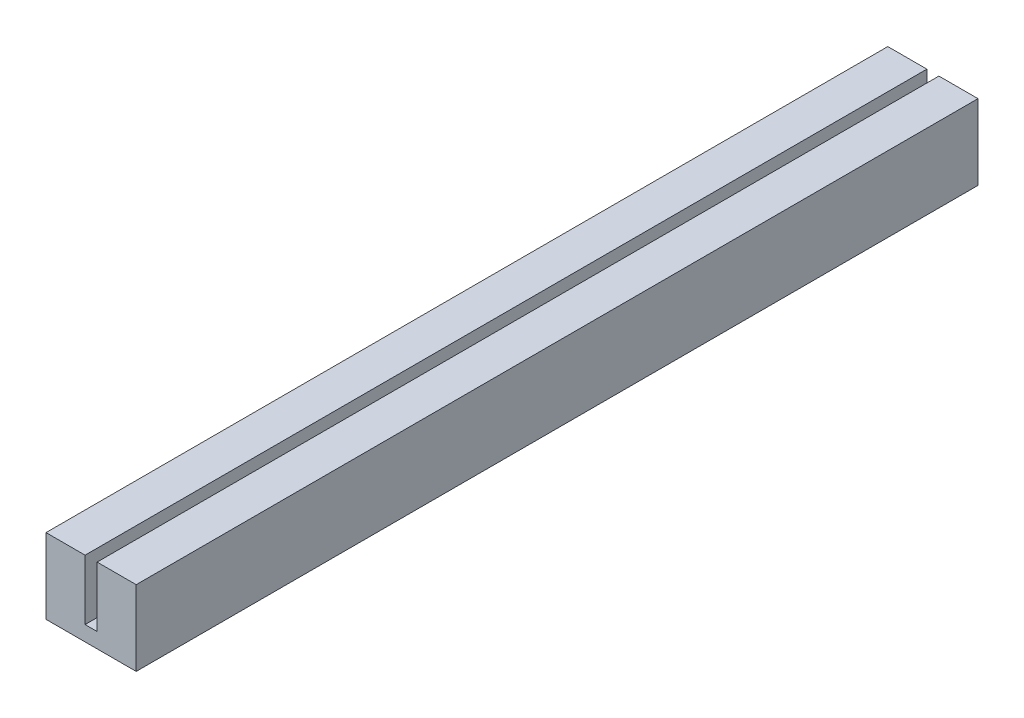
ISO-10303-21;
HEADER;
FILE_DESCRIPTION(('STEP AP214'),'2;1');
FILE_NAME('part.step','',(''),(''),'','','');
FILE_SCHEMA(('AUTOMOTIVE_DESIGN { 1 0 10303 214 1 1 1 1 }'));
ENDSEC;
DATA;
#1=APPLICATION_CONTEXT('core data for automotive mechanical design processes');
#2=APPLICATION_PROTOCOL_DEFINITION('international standard','automotive_design',2000,#1);
#3=PRODUCT_CONTEXT('',#1,'mechanical');
#4=PRODUCT('Part','Part','',(#3));
#5=PRODUCT_RELATED_PRODUCT_CATEGORY('part','',(#4));
#6=PRODUCT_DEFINITION_FORMATION('','',#4);
#7=PRODUCT_DEFINITION_CONTEXT('part definition',#1,'design');
#8=PRODUCT_DEFINITION('design','',#6,#7);
#9=PRODUCT_DEFINITION_SHAPE('','',#8);
#10=(LENGTH_UNIT() NAMED_UNIT(*) SI_UNIT(.MILLI.,.METRE.));
#11=(NAMED_UNIT(*) PLANE_ANGLE_UNIT() SI_UNIT($,.RADIAN.));
#12=(NAMED_UNIT(*) SI_UNIT($,.STERADIAN.) SOLID_ANGLE_UNIT());
#13=UNCERTAINTY_MEASURE_WITH_UNIT(LENGTH_MEASURE(1.E-05),#10,'distance_accuracy_value','');
#14=(GEOMETRIC_REPRESENTATION_CONTEXT(3) GLOBAL_UNCERTAINTY_ASSIGNED_CONTEXT((#13)) GLOBAL_UNIT_ASSIGNED_CONTEXT((#10,
#11,#12)) REPRESENTATION_CONTEXT('',''));
#15=CARTESIAN_POINT('',(0.,0.,0.));
#16=DIRECTION('',(0.,0.,1.));
#17=DIRECTION('',(1.,0.,0.));
#18=AXIS2_PLACEMENT_3D('',#15,#16,#17);
#19=CARTESIAN_POINT('',(0.,-5.,-46.654148940095));
#20=DIRECTION('',(-1.,0.,0.));
#21=DIRECTION('',(0.,0.,1.));
#22=AXIS2_PLACEMENT_3D('',#19,#20,#21);
#23=PLANE('',#22);
#24=DIRECTION('',(0.,1.,0.));
#25=VECTOR('',#24,1.);
#26=CARTESIAN_POINT('',(0.,-5.,233.345851059905));
#27=LINE('',#26,#25);
#28=CARTESIAN_POINT('',(0.,-5.,233.345851059905));
#29=VERTEX_POINT('',#28);
#30=CARTESIAN_POINT('',(0.,20.,233.345851059905));
#31=VERTEX_POINT('',#30);
#32=EDGE_CURVE('E46',#29,#31,#27,.T.);
#33=ORIENTED_EDGE('',*,*,#32,.T.);
#34=DIRECTION('',(0.,0.,1.));
#35=VECTOR('',#34,1.);
#36=CARTESIAN_POINT('',(0.,20.,-46.654148940095));
#37=LINE('',#36,#35);
#38=CARTESIAN_POINT('',(0.,20.,-46.654148940095));
#39=VERTEX_POINT('',#38);
#40=EDGE_CURVE('E109',#39,#31,#37,.T.);
#41=ORIENTED_EDGE('',*,*,#40,.F.);
#42=DIRECTION('',(0.,1.,0.));
#43=VECTOR('',#42,1.);
#44=CARTESIAN_POINT('',(0.,-5.,-46.654148940095));
#45=LINE('',#44,#43);
#46=CARTESIAN_POINT('',(0.,-5.,-46.654148940095));
#47=VERTEX_POINT('',#46);
#48=EDGE_CURVE('E11',#47,#39,#45,.T.);
#49=ORIENTED_EDGE('',*,*,#48,.F.);
#50=DIRECTION('',(0.,0.,1.));
#51=VECTOR('',#50,1.);
#52=CARTESIAN_POINT('',(0.,-5.,-46.654148940095));
#53=LINE('',#52,#51);
#54=EDGE_CURVE('E111',#47,#29,#53,.T.);
#55=ORIENTED_EDGE('',*,*,#54,.T.);
#56=EDGE_LOOP('',(#33,#41,#49,#55));
#57=FACE_BOUND('',#56,.T.);
#58=ADVANCED_FACE('F43',(#57),#23,.T.);
#59=CARTESIAN_POINT('',(0.,-5.,-46.654148940095));
#60=DIRECTION('',(0.,0.,-1.));
#61=DIRECTION('',(-1.,0.,0.));
#62=AXIS2_PLACEMENT_3D('',#59,#60,#61);
#63=PLANE('',#62);
#64=DIRECTION('',(-1.,0.,0.));
#65=VECTOR('',#64,1.);
#66=CARTESIAN_POINT('',(0.,0.,-46.654148940095));
#67=LINE('',#66,#65);
#68=CARTESIAN_POINT('',(17.,0.,-46.654148940095));
#69=VERTEX_POINT('',#68);
#70=CARTESIAN_POINT('',(13.,0.,-46.654148940095));
#71=VERTEX_POINT('',#70);
#72=EDGE_CURVE('E159',#69,#71,#67,.T.);
#73=ORIENTED_EDGE('',*,*,#72,.F.);
#74=DIRECTION('',(0.,-1.,0.));
#75=VECTOR('',#74,1.);
#76=CARTESIAN_POINT('',(17.,20.,-46.654148940095));
#77=LINE('',#76,#75);
#78=CARTESIAN_POINT('',(17.,20.,-46.654148940095));
#79=VERTEX_POINT('',#78);
#80=EDGE_CURVE('E140',#79,#69,#77,.T.);
#81=ORIENTED_EDGE('',*,*,#80,.F.);
#82=DIRECTION('',(-1.,0.,0.));
#83=VECTOR('',#82,1.);
#84=CARTESIAN_POINT('',(30.,20.,-46.654148940095));
#85=LINE('',#84,#83);
#86=CARTESIAN_POINT('',(30.,20.,-46.654148940095));
#87=VERTEX_POINT('',#86);
#88=EDGE_CURVE('E153',#87,#79,#85,.T.);
#89=ORIENTED_EDGE('',*,*,#88,.F.);
#90=DIRECTION('',(0.,1.,0.));
#91=VECTOR('',#90,1.);
#92=CARTESIAN_POINT('',(30.,-5.,-46.654148940095));
#93=LINE('',#92,#91);
#94=CARTESIAN_POINT('',(30.,-5.,-46.654148940095));
#95=VERTEX_POINT('',#94);
#96=EDGE_CURVE('E51',#95,#87,#93,.T.);
#97=ORIENTED_EDGE('',*,*,#96,.F.);
#98=DIRECTION('',(-1.,0.,0.));
#99=VECTOR('',#98,1.);
#100=CARTESIAN_POINT('',(0.,-5.,-46.654148940095));
#101=LINE('',#100,#99);
#102=EDGE_CURVE('E116',#95,#47,#101,.T.);
#103=ORIENTED_EDGE('',*,*,#102,.T.);
#104=ORIENTED_EDGE('',*,*,#48,.T.);
#105=DIRECTION('',(-1.,0.,0.));
#106=VECTOR('',#105,1.);
#107=CARTESIAN_POINT('',(0.,20.,-46.654148940095));
#108=LINE('',#107,#106);
#109=CARTESIAN_POINT('',(13.,20.,-46.654148940095));
#110=VERTEX_POINT('',#109);
#111=EDGE_CURVE('E129',#110,#39,#108,.T.);
#112=ORIENTED_EDGE('',*,*,#111,.F.);
#113=DIRECTION('',(0.,-1.,0.));
#114=VECTOR('',#113,1.);
#115=CARTESIAN_POINT('',(13.,20.,-46.654148940095));
#116=LINE('',#115,#114);
#117=EDGE_CURVE('E134',#110,#71,#116,.T.);
#118=ORIENTED_EDGE('',*,*,#117,.T.);
#119=EDGE_LOOP('',(#73,#81,#89,#97,#103,#104,#112,#118));
#120=FACE_BOUND('',#119,.T.);
#121=ADVANCED_FACE('F181',(#120),#63,.T.);
#122=CARTESIAN_POINT('',(30.,-5.,-46.654148940095));
#123=DIRECTION('',(1.,0.,0.));
#124=DIRECTION('',(0.,0.,-1.));
#125=AXIS2_PLACEMENT_3D('',#122,#123,#124);
#126=PLANE('',#125);
#127=ORIENTED_EDGE('',*,*,#96,.T.);
#128=DIRECTION('',(0.,0.,-1.));
#129=VECTOR('',#128,1.);
#130=CARTESIAN_POINT('',(30.,20.,-46.654148940095));
#131=LINE('',#130,#129);
#132=CARTESIAN_POINT('',(30.,20.,233.345851059905));
#133=VERTEX_POINT('',#132);
#134=EDGE_CURVE('E148',#133,#87,#131,.T.);
#135=ORIENTED_EDGE('',*,*,#134,.F.);
#136=DIRECTION('',(0.,1.,0.));
#137=VECTOR('',#136,1.);
#138=CARTESIAN_POINT('',(30.,-5.,233.345851059905));
#139=LINE('',#138,#137);
#140=CARTESIAN_POINT('',(30.,-5.,233.345851059905));
#141=VERTEX_POINT('',#140);
#142=EDGE_CURVE('E115',#141,#133,#139,.T.);
#143=ORIENTED_EDGE('',*,*,#142,.F.);
#144=DIRECTION('',(0.,0.,-1.));
#145=VECTOR('',#144,1.);
#146=CARTESIAN_POINT('',(30.,-5.,-46.654148940095));
#147=LINE('',#146,#145);
#148=EDGE_CURVE('E161',#141,#95,#147,.T.);
#149=ORIENTED_EDGE('',*,*,#148,.T.);
#150=EDGE_LOOP('',(#127,#135,#143,#149));
#151=FACE_BOUND('',#150,.T.);
#152=ADVANCED_FACE('F176',(#151),#126,.T.);
#153=CARTESIAN_POINT('',(0.,-5.,233.345851059905));
#154=DIRECTION('',(0.,0.,1.));
#155=DIRECTION('',(1.,0.,0.));
#156=AXIS2_PLACEMENT_3D('',#153,#154,#155);
#157=PLANE('',#156);
#158=DIRECTION('',(1.,0.,0.));
#159=VECTOR('',#158,1.);
#160=CARTESIAN_POINT('',(0.,0.,233.345851059905));
#161=LINE('',#160,#159);
#162=CARTESIAN_POINT('',(13.,0.,233.345851059905));
#163=VERTEX_POINT('',#162);
#164=CARTESIAN_POINT('',(17.,0.,233.345851059905));
#165=VERTEX_POINT('',#164);
#166=EDGE_CURVE('E139',#163,#165,#161,.T.);
#167=ORIENTED_EDGE('',*,*,#166,.F.);
#168=DIRECTION('',(0.,-1.,0.));
#169=VECTOR('',#168,1.);
#170=CARTESIAN_POINT('',(13.,20.,233.345851059905));
#171=LINE('',#170,#169);
#172=CARTESIAN_POINT('',(13.,20.,233.345851059905));
#173=VERTEX_POINT('',#172);
#174=EDGE_CURVE('E121',#173,#163,#171,.T.);
#175=ORIENTED_EDGE('',*,*,#174,.F.);
#176=DIRECTION('',(1.,0.,0.));
#177=VECTOR('',#176,1.);
#178=CARTESIAN_POINT('',(0.,20.,233.345851059905));
#179=LINE('',#178,#177);
#180=EDGE_CURVE('E118',#31,#173,#179,.T.);
#181=ORIENTED_EDGE('',*,*,#180,.F.);
#182=ORIENTED_EDGE('',*,*,#32,.F.);
#183=DIRECTION('',(1.,0.,0.));
#184=VECTOR('',#183,1.);
#185=CARTESIAN_POINT('',(0.,-5.,233.345851059905));
#186=LINE('',#185,#184);
#187=EDGE_CURVE('E158',#29,#141,#186,.T.);
#188=ORIENTED_EDGE('',*,*,#187,.T.);
#189=ORIENTED_EDGE('',*,*,#142,.T.);
#190=DIRECTION('',(1.,0.,0.));
#191=VECTOR('',#190,1.);
#192=CARTESIAN_POINT('',(30.,20.,233.345851059905));
#193=LINE('',#192,#191);
#194=CARTESIAN_POINT('',(17.,20.,233.345851059905));
#195=VERTEX_POINT('',#194);
#196=EDGE_CURVE('E146',#195,#133,#193,.T.);
#197=ORIENTED_EDGE('',*,*,#196,.F.);
#198=DIRECTION('',(0.,-1.,0.));
#199=VECTOR('',#198,1.);
#200=CARTESIAN_POINT('',(17.,20.,233.345851059905));
#201=LINE('',#200,#199);
#202=EDGE_CURVE('E143',#195,#165,#201,.T.);
#203=ORIENTED_EDGE('',*,*,#202,.T.);
#204=EDGE_LOOP('',(#167,#175,#181,#182,#188,#189,#197,#203));
#205=FACE_BOUND('',#204,.T.);
#206=ADVANCED_FACE('F119',(#205),#157,.T.);
#207=CARTESIAN_POINT('',(0.,-5.,0.));
#208=DIRECTION('',(0.,1.,0.));
#209=DIRECTION('',(0.,0.,1.));
#210=AXIS2_PLACEMENT_3D('',#207,#208,#209);
#211=PLANE('',#210);
#212=ORIENTED_EDGE('',*,*,#54,.F.);
#213=ORIENTED_EDGE('',*,*,#102,.F.);
#214=ORIENTED_EDGE('',*,*,#148,.F.);
#215=ORIENTED_EDGE('',*,*,#187,.F.);
#216=EDGE_LOOP('',(#212,#213,#214,#215));
#217=FACE_BOUND('',#216,.T.);
#218=ADVANCED_FACE('F188',(#217),#211,.F.);
#219=CARTESIAN_POINT('',(0.,0.,0.));
#220=DIRECTION('',(0.,1.,0.));
#221=DIRECTION('',(0.,0.,1.));
#222=AXIS2_PLACEMENT_3D('',#219,#220,#221);
#223=PLANE('',#222);
#224=DIRECTION('',(0.,0.,-1.));
#225=VECTOR('',#224,1.);
#226=CARTESIAN_POINT('',(13.,0.,-46.654148940095));
#227=LINE('',#226,#225);
#228=EDGE_CURVE('E64',#163,#71,#227,.T.);
#229=ORIENTED_EDGE('',*,*,#228,.F.);
#230=ORIENTED_EDGE('',*,*,#166,.T.);
#231=DIRECTION('',(0.,0.,1.));
#232=VECTOR('',#231,1.);
#233=CARTESIAN_POINT('',(17.,0.,-46.654148940095));
#234=LINE('',#233,#232);
#235=EDGE_CURVE('E59',#69,#165,#234,.T.);
#236=ORIENTED_EDGE('',*,*,#235,.F.);
#237=ORIENTED_EDGE('',*,*,#72,.T.);
#238=EDGE_LOOP('',(#229,#230,#236,#237));
#239=FACE_BOUND('',#238,.T.);
#240=ADVANCED_FACE('F190',(#239),#223,.T.);
#241=CARTESIAN_POINT('',(17.,20.,-46.654148940095));
#242=DIRECTION('',(1.,0.,0.));
#243=DIRECTION('',(0.,0.,-1.));
#244=AXIS2_PLACEMENT_3D('',#241,#242,#243);
#245=PLANE('',#244);
#246=ORIENTED_EDGE('',*,*,#235,.T.);
#247=ORIENTED_EDGE('',*,*,#202,.F.);
#248=DIRECTION('',(0.,0.,1.));
#249=VECTOR('',#248,1.);
#250=CARTESIAN_POINT('',(17.,20.,-46.654148940095));
#251=LINE('',#250,#249);
#252=EDGE_CURVE('E151',#79,#195,#251,.T.);
#253=ORIENTED_EDGE('',*,*,#252,.F.);
#254=ORIENTED_EDGE('',*,*,#80,.T.);
#255=EDGE_LOOP('',(#246,#247,#253,#254));
#256=FACE_BOUND('',#255,.T.);
#257=ADVANCED_FACE('F183',(#256),#245,.F.);
#258=CARTESIAN_POINT('',(0.,20.,0.));
#259=DIRECTION('',(0.,-1.,0.));
#260=DIRECTION('',(0.,0.,-1.));
#261=AXIS2_PLACEMENT_3D('',#258,#259,#260);
#262=PLANE('',#261);
#263=ORIENTED_EDGE('',*,*,#134,.T.);
#264=ORIENTED_EDGE('',*,*,#88,.T.);
#265=ORIENTED_EDGE('',*,*,#252,.T.);
#266=ORIENTED_EDGE('',*,*,#196,.T.);
#267=EDGE_LOOP('',(#263,#264,#265,#266));
#268=FACE_BOUND('',#267,.T.);
#269=ADVANCED_FACE('F173',(#268),#262,.F.);
#270=CARTESIAN_POINT('',(13.,20.,-46.654148940095));
#271=DIRECTION('',(-1.,0.,0.));
#272=DIRECTION('',(0.,0.,1.));
#273=AXIS2_PLACEMENT_3D('',#270,#271,#272);
#274=PLANE('',#273);
#275=ORIENTED_EDGE('',*,*,#228,.T.);
#276=ORIENTED_EDGE('',*,*,#117,.F.);
#277=DIRECTION('',(0.,0.,-1.));
#278=VECTOR('',#277,1.);
#279=CARTESIAN_POINT('',(13.,20.,-46.654148940095));
#280=LINE('',#279,#278);
#281=EDGE_CURVE('E124',#173,#110,#280,.T.);
#282=ORIENTED_EDGE('',*,*,#281,.F.);
#283=ORIENTED_EDGE('',*,*,#174,.T.);
#284=EDGE_LOOP('',(#275,#276,#282,#283));
#285=FACE_BOUND('',#284,.T.);
#286=ADVANCED_FACE('F185',(#285),#274,.F.);
#287=CARTESIAN_POINT('',(0.,20.,0.));
#288=DIRECTION('',(0.,1.,0.));
#289=DIRECTION('',(0.,0.,1.));
#290=AXIS2_PLACEMENT_3D('',#287,#288,#289);
#291=PLANE('',#290);
#292=ORIENTED_EDGE('',*,*,#40,.T.);
#293=ORIENTED_EDGE('',*,*,#180,.T.);
#294=ORIENTED_EDGE('',*,*,#281,.T.);
#295=ORIENTED_EDGE('',*,*,#111,.T.);
#296=EDGE_LOOP('',(#292,#293,#294,#295));
#297=FACE_BOUND('',#296,.T.);
#298=ADVANCED_FACE('F127',(#297),#291,.T.);
#299=CLOSED_SHELL('',(#58,#121,#152,#206,#218,#240,#257,#269,#286,#298));
#300=MANIFOLD_SOLID_BREP('B2',#299);
#301=ADVANCED_BREP_SHAPE_REPRESENTATION('',(#18,#300),#14);
#302=SHAPE_DEFINITION_REPRESENTATION(#9,#301);
ENDSEC;
END-ISO-10303-21;
